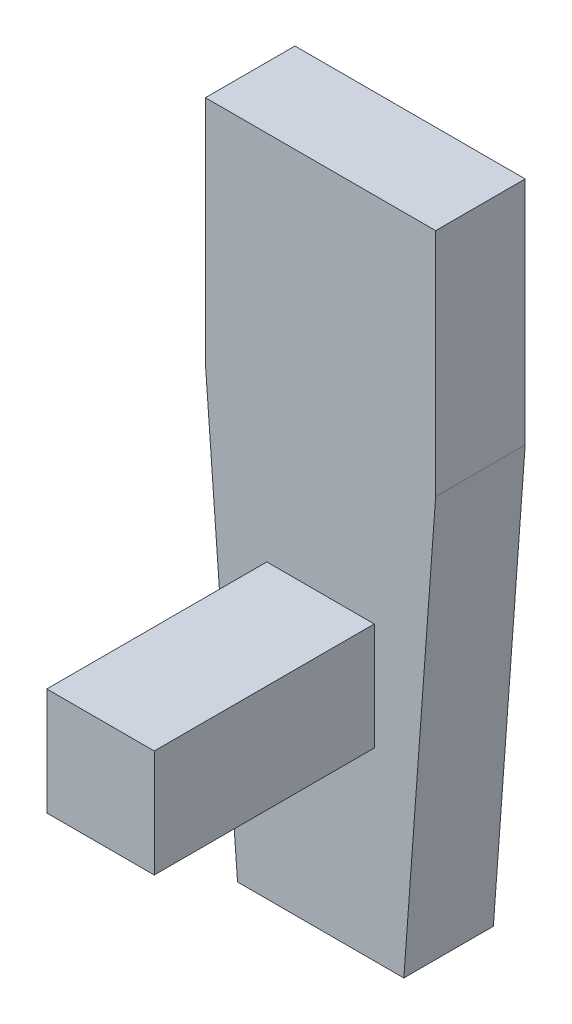
ISO-10303-21;
HEADER;
FILE_DESCRIPTION(('STEP AP214'),'2;1');
FILE_NAME('part.step','',(''),(''),'','','');
FILE_SCHEMA(('AUTOMOTIVE_DESIGN { 1 0 10303 214 1 1 1 1 }'));
ENDSEC;
DATA;
#1=APPLICATION_CONTEXT('core data for automotive mechanical design processes');
#2=APPLICATION_PROTOCOL_DEFINITION('international standard','automotive_design',2000,#1);
#3=PRODUCT_CONTEXT('',#1,'mechanical');
#4=PRODUCT('Part','Part','',(#3));
#5=PRODUCT_RELATED_PRODUCT_CATEGORY('part','',(#4));
#6=PRODUCT_DEFINITION_FORMATION('','',#4);
#7=PRODUCT_DEFINITION_CONTEXT('part definition',#1,'design');
#8=PRODUCT_DEFINITION('design','',#6,#7);
#9=PRODUCT_DEFINITION_SHAPE('','',#8);
#10=(LENGTH_UNIT() NAMED_UNIT(*) SI_UNIT(.MILLI.,.METRE.));
#11=(NAMED_UNIT(*) PLANE_ANGLE_UNIT() SI_UNIT($,.RADIAN.));
#12=(NAMED_UNIT(*) SI_UNIT($,.STERADIAN.) SOLID_ANGLE_UNIT());
#13=UNCERTAINTY_MEASURE_WITH_UNIT(LENGTH_MEASURE(1.E-05),#10,'distance_accuracy_value','');
#14=(GEOMETRIC_REPRESENTATION_CONTEXT(3) GLOBAL_UNCERTAINTY_ASSIGNED_CONTEXT((#13)) GLOBAL_UNIT_ASSIGNED_CONTEXT((#10,
#11,#12)) REPRESENTATION_CONTEXT('',''));
#15=CARTESIAN_POINT('',(0.,0.,0.));
#16=DIRECTION('',(0.,0.,1.));
#17=DIRECTION('',(1.,0.,0.));
#18=AXIS2_PLACEMENT_3D('',#15,#16,#17);
#19=CARTESIAN_POINT('',(35.7099981617146,-2.62608818731381,35.));
#20=DIRECTION('',(0.997306904187828,-0.0733412493709412,0.));
#21=DIRECTION('',(0.0733412493709412,0.997306904187828,0.));
#22=AXIS2_PLACEMENT_3D('',#19,#20,#21);
#23=PLANE('',#22);
#24=DIRECTION('',(-0.0733412493709412,-0.997306904187828,0.));
#25=VECTOR('',#24,1.);
#26=CARTESIAN_POINT('',(35.7099981617146,-2.62608818731381,0.));
#27=LINE('',#26,#25);
#28=CARTESIAN_POINT('',(45.,123.700952225916,0.));
#29=VERTEX_POINT('',#28);
#30=CARTESIAN_POINT('',(32.5551050720874,-45.5268662248671,0.));
#31=VERTEX_POINT('',#30);
#32=EDGE_CURVE('E265',#29,#31,#27,.T.);
#33=ORIENTED_EDGE('',*,*,#32,.F.);
#34=DIRECTION('',(0.,0.,-1.));
#35=VECTOR('',#34,1.);
#36=CARTESIAN_POINT('',(45.,123.700952225916,35.));
#37=LINE('',#36,#35);
#38=CARTESIAN_POINT('',(45.,123.700952225916,35.));
#39=VERTEX_POINT('',#38);
#40=EDGE_CURVE('E11',#39,#29,#37,.T.);
#41=ORIENTED_EDGE('',*,*,#40,.F.);
#42=DIRECTION('',(-0.0733412493709412,-0.997306904187828,0.));
#43=VECTOR('',#42,1.);
#44=CARTESIAN_POINT('',(35.7099981617146,-2.62608818731381,35.));
#45=LINE('',#44,#43);
#46=CARTESIAN_POINT('',(32.5551050720874,-45.5268662248671,35.));
#47=VERTEX_POINT('',#46);
#48=EDGE_CURVE('E266',#39,#47,#45,.T.);
#49=ORIENTED_EDGE('',*,*,#48,.T.);
#50=DIRECTION('',(0.,0.,-1.));
#51=VECTOR('',#50,1.);
#52=CARTESIAN_POINT('',(32.5551050720874,-45.5268662248671,35.));
#53=LINE('',#52,#51);
#54=EDGE_CURVE('E283',#47,#31,#53,.T.);
#55=ORIENTED_EDGE('',*,*,#54,.T.);
#56=EDGE_LOOP('',(#33,#41,#49,#55));
#57=FACE_BOUND('',#56,.T.);
#58=ADVANCED_FACE('F41',(#57),#23,.T.);
#59=CARTESIAN_POINT('',(45.,0.,35.));
#60=DIRECTION('',(-1.,0.,0.));
#61=DIRECTION('',(0.,0.,1.));
#62=AXIS2_PLACEMENT_3D('',#59,#60,#61);
#63=PLANE('',#62);
#64=DIRECTION('',(0.,1.,0.));
#65=VECTOR('',#64,1.);
#66=CARTESIAN_POINT('',(45.,0.,0.));
#67=LINE('',#66,#65);
#68=CARTESIAN_POINT('',(45.,213.700952225916,0.));
#69=VERTEX_POINT('',#68);
#70=EDGE_CURVE('E286',#29,#69,#67,.T.);
#71=ORIENTED_EDGE('',*,*,#70,.T.);
#72=DIRECTION('',(0.,0.,-1.));
#73=VECTOR('',#72,1.);
#74=CARTESIAN_POINT('',(45.,213.700952225916,35.));
#75=LINE('',#74,#73);
#76=CARTESIAN_POINT('',(45.,213.700952225916,35.));
#77=VERTEX_POINT('',#76);
#78=EDGE_CURVE('E48',#77,#69,#75,.T.);
#79=ORIENTED_EDGE('',*,*,#78,.F.);
#80=DIRECTION('',(0.,1.,0.));
#81=VECTOR('',#80,1.);
#82=CARTESIAN_POINT('',(45.,0.,35.));
#83=LINE('',#82,#81);
#84=EDGE_CURVE('E269',#39,#77,#83,.T.);
#85=ORIENTED_EDGE('',*,*,#84,.F.);
#86=ORIENTED_EDGE('',*,*,#40,.T.);
#87=EDGE_LOOP('',(#71,#79,#85,#86));
#88=FACE_BOUND('',#87,.T.);
#89=ADVANCED_FACE('F314',(#88),#63,.F.);
#90=CARTESIAN_POINT('',(0.,213.700952225916,35.));
#91=DIRECTION('',(0.,1.,0.));
#92=DIRECTION('',(0.,0.,1.));
#93=AXIS2_PLACEMENT_3D('',#90,#91,#92);
#94=PLANE('',#93);
#95=DIRECTION('',(1.,0.,0.));
#96=VECTOR('',#95,1.);
#97=CARTESIAN_POINT('',(0.,213.700952225916,0.));
#98=LINE('',#97,#96);
#99=CARTESIAN_POINT('',(-45.,213.700952225916,0.));
#100=VERTEX_POINT('',#99);
#101=EDGE_CURVE('E289',#100,#69,#98,.T.);
#102=ORIENTED_EDGE('',*,*,#101,.F.);
#103=DIRECTION('',(0.,0.,-1.));
#104=VECTOR('',#103,1.);
#105=CARTESIAN_POINT('',(-45.,213.700952225916,35.));
#106=LINE('',#105,#104);
#107=CARTESIAN_POINT('',(-45.,213.700952225916,35.));
#108=VERTEX_POINT('',#107);
#109=EDGE_CURVE('E305',#108,#100,#106,.T.);
#110=ORIENTED_EDGE('',*,*,#109,.F.);
#111=DIRECTION('',(1.,0.,0.));
#112=VECTOR('',#111,1.);
#113=CARTESIAN_POINT('',(0.,213.700952225916,35.));
#114=LINE('',#113,#112);
#115=EDGE_CURVE('E272',#108,#77,#114,.T.);
#116=ORIENTED_EDGE('',*,*,#115,.T.);
#117=ORIENTED_EDGE('',*,*,#78,.T.);
#118=EDGE_LOOP('',(#102,#110,#116,#117));
#119=FACE_BOUND('',#118,.T.);
#120=ADVANCED_FACE('F309',(#119),#94,.T.);
#121=CARTESIAN_POINT('',(-45.,0.,35.));
#122=DIRECTION('',(-1.,0.,0.));
#123=DIRECTION('',(0.,0.,1.));
#124=AXIS2_PLACEMENT_3D('',#121,#122,#123);
#125=PLANE('',#124);
#126=DIRECTION('',(0.,1.,0.));
#127=VECTOR('',#126,1.);
#128=CARTESIAN_POINT('',(-45.,0.,0.));
#129=LINE('',#128,#127);
#130=CARTESIAN_POINT('',(-45.,123.700952225917,0.));
#131=VERTEX_POINT('',#130);
#132=EDGE_CURVE('E292',#131,#100,#129,.T.);
#133=ORIENTED_EDGE('',*,*,#132,.F.);
#134=DIRECTION('',(0.,0.,-1.));
#135=VECTOR('',#134,1.);
#136=CARTESIAN_POINT('',(-45.,123.700952225917,35.));
#137=LINE('',#136,#135);
#138=CARTESIAN_POINT('',(-45.,123.700952225917,35.));
#139=VERTEX_POINT('',#138);
#140=EDGE_CURVE('E303',#139,#131,#137,.T.);
#141=ORIENTED_EDGE('',*,*,#140,.F.);
#142=DIRECTION('',(0.,1.,0.));
#143=VECTOR('',#142,1.);
#144=CARTESIAN_POINT('',(-45.,0.,35.));
#145=LINE('',#144,#143);
#146=EDGE_CURVE('E275',#139,#108,#145,.T.);
#147=ORIENTED_EDGE('',*,*,#146,.T.);
#148=ORIENTED_EDGE('',*,*,#109,.T.);
#149=EDGE_LOOP('',(#133,#141,#147,#148));
#150=FACE_BOUND('',#149,.T.);
#151=ADVANCED_FACE('F322',(#150),#125,.T.);
#152=CARTESIAN_POINT('',(-35.6264616937075,-2.64314681833047,35.));
#153=DIRECTION('',(-0.997259190456473,-0.0739872086924482,0.));
#154=DIRECTION('',(0.0739872086924482,-0.997259190456473,0.));
#155=AXIS2_PLACEMENT_3D('',#152,#153,#154);
#156=PLANE('',#155);
#157=DIRECTION('',(-0.0739872086924482,0.997259190456473,0.));
#158=VECTOR('',#157,1.);
#159=CARTESIAN_POINT('',(-35.6264616937075,-2.64314681833047,0.));
#160=LINE('',#159,#158);
#161=CARTESIAN_POINT('',(-32.4448949279126,-45.5268662248671,0.));
#162=VERTEX_POINT('',#161);
#163=EDGE_CURVE('E295',#162,#131,#160,.T.);
#164=ORIENTED_EDGE('',*,*,#163,.F.);
#165=DIRECTION('',(0.,0.,-1.));
#166=VECTOR('',#165,1.);
#167=CARTESIAN_POINT('',(-32.4448949279126,-45.5268662248671,35.));
#168=LINE('',#167,#166);
#169=CARTESIAN_POINT('',(-32.4448949279126,-45.5268662248671,35.));
#170=VERTEX_POINT('',#169);
#171=EDGE_CURVE('E301',#170,#162,#168,.T.);
#172=ORIENTED_EDGE('',*,*,#171,.F.);
#173=DIRECTION('',(-0.0739872086924482,0.997259190456473,0.));
#174=VECTOR('',#173,1.);
#175=CARTESIAN_POINT('',(-35.6264616937075,-2.64314681833047,35.));
#176=LINE('',#175,#174);
#177=EDGE_CURVE('E278',#170,#139,#176,.T.);
#178=ORIENTED_EDGE('',*,*,#177,.T.);
#179=ORIENTED_EDGE('',*,*,#140,.T.);
#180=EDGE_LOOP('',(#164,#172,#178,#179));
#181=FACE_BOUND('',#180,.T.);
#182=ADVANCED_FACE('F333',(#181),#156,.T.);
#183=CARTESIAN_POINT('',(0.,-45.5268662248671,35.));
#184=DIRECTION('',(0.,1.,0.));
#185=DIRECTION('',(0.,0.,1.));
#186=AXIS2_PLACEMENT_3D('',#183,#184,#185);
#187=PLANE('',#186);
#188=DIRECTION('',(1.,0.,0.));
#189=VECTOR('',#188,1.);
#190=CARTESIAN_POINT('',(0.,-45.5268662248671,0.));
#191=LINE('',#190,#189);
#192=EDGE_CURVE('E270',#162,#31,#191,.T.);
#193=ORIENTED_EDGE('',*,*,#192,.T.);
#194=ORIENTED_EDGE('',*,*,#54,.F.);
#195=DIRECTION('',(1.,0.,0.));
#196=VECTOR('',#195,1.);
#197=CARTESIAN_POINT('',(0.,-45.5268662248671,35.));
#198=LINE('',#197,#196);
#199=EDGE_CURVE('E281',#170,#47,#198,.T.);
#200=ORIENTED_EDGE('',*,*,#199,.F.);
#201=ORIENTED_EDGE('',*,*,#171,.T.);
#202=EDGE_LOOP('',(#193,#194,#200,#201));
#203=FACE_BOUND('',#202,.T.);
#204=ADVANCED_FACE('F334',(#203),#187,.F.);
#205=CARTESIAN_POINT('',(0.,0.,35.));
#206=DIRECTION('',(0.,0.,1.));
#207=DIRECTION('',(1.,0.,0.));
#208=AXIS2_PLACEMENT_3D('',#205,#206,#207);
#209=PLANE('',#208);
#210=DIRECTION('',(0.,1.,0.));
#211=VECTOR('',#210,1.);
#212=CARTESIAN_POINT('',(21.,26.5490732587276,35.));
#213=LINE('',#212,#211);
#214=CARTESIAN_POINT('',(21.,26.5490732587276,35.));
#215=VERTEX_POINT('',#214);
#216=CARTESIAN_POINT('',(21.,68.5490732587276,35.));
#217=VERTEX_POINT('',#216);
#218=EDGE_CURVE('E171',#215,#217,#213,.T.);
#219=ORIENTED_EDGE('',*,*,#218,.F.);
#220=DIRECTION('',(1.,0.,0.));
#221=VECTOR('',#220,1.);
#222=CARTESIAN_POINT('',(-21.,26.5490732587276,35.));
#223=LINE('',#222,#221);
#224=CARTESIAN_POINT('',(-21.,26.5490732587276,35.));
#225=VERTEX_POINT('',#224);
#226=EDGE_CURVE('E237',#225,#215,#223,.T.);
#227=ORIENTED_EDGE('',*,*,#226,.F.);
#228=DIRECTION('',(0.,-1.,0.));
#229=VECTOR('',#228,1.);
#230=CARTESIAN_POINT('',(-21.,26.5490732587276,35.));
#231=LINE('',#230,#229);
#232=CARTESIAN_POINT('',(-21.,68.5490732587276,35.));
#233=VERTEX_POINT('',#232);
#234=EDGE_CURVE('E249',#233,#225,#231,.T.);
#235=ORIENTED_EDGE('',*,*,#234,.F.);
#236=DIRECTION('',(-1.,0.,0.));
#237=VECTOR('',#236,1.);
#238=CARTESIAN_POINT('',(-21.,68.5490732587276,35.));
#239=LINE('',#238,#237);
#240=EDGE_CURVE('E246',#217,#233,#239,.T.);
#241=ORIENTED_EDGE('',*,*,#240,.F.);
#242=EDGE_LOOP('',(#219,#227,#235,#241));
#243=FACE_BOUND('',#242,.T.);
#244=ORIENTED_EDGE('',*,*,#48,.F.);
#245=ORIENTED_EDGE('',*,*,#84,.T.);
#246=ORIENTED_EDGE('',*,*,#115,.F.);
#247=ORIENTED_EDGE('',*,*,#146,.F.);
#248=ORIENTED_EDGE('',*,*,#177,.F.);
#249=ORIENTED_EDGE('',*,*,#199,.T.);
#250=EDGE_LOOP('',(#244,#245,#246,#247,#248,#249));
#251=FACE_BOUND('',#250,.T.);
#252=ADVANCED_FACE('F326',(#243,#251),#209,.T.);
#253=CARTESIAN_POINT('',(0.,0.,0.));
#254=DIRECTION('',(0.,0.,1.));
#255=DIRECTION('',(1.,0.,0.));
#256=AXIS2_PLACEMENT_3D('',#253,#254,#255);
#257=PLANE('',#256);
#258=DIRECTION('',(-0.00555950071674918,-0.999984545856475,0.));
#259=VECTOR('',#258,1.);
#260=CARTESIAN_POINT('',(21.6740739200049,-0.120498891700309,0.));
#261=LINE('',#260,#259);
#262=CARTESIAN_POINT('',(22.4875605860502,146.200930990465,0.));
#263=VERTEX_POINT('',#262);
#264=CARTESIAN_POINT('',(22.0497692514754,67.4556279157162,0.));
#265=VERTEX_POINT('',#264);
#266=EDGE_CURVE('E202',#263,#265,#261,.T.);
#267=ORIENTED_EDGE('',*,*,#266,.F.);
#268=DIRECTION('',(0.,1.,0.));
#269=VECTOR('',#268,1.);
#270=CARTESIAN_POINT('',(22.4875605860503,0.,0.));
#271=LINE('',#270,#269);
#272=CARTESIAN_POINT('',(22.4875605860502,191.200930990465,0.));
#273=VERTEX_POINT('',#272);
#274=EDGE_CURVE('E55',#263,#273,#271,.T.);
#275=ORIENTED_EDGE('',*,*,#274,.T.);
#276=DIRECTION('',(-1.,0.,0.));
#277=VECTOR('',#276,1.);
#278=CARTESIAN_POINT('',(0.,191.200930990465,0.));
#279=LINE('',#278,#277);
#280=CARTESIAN_POINT('',(-22.5124394139497,191.200930990465,0.));
#281=VERTEX_POINT('',#280);
#282=EDGE_CURVE('E60',#273,#281,#279,.T.);
#283=ORIENTED_EDGE('',*,*,#282,.T.);
#284=DIRECTION('',(0.,1.,0.));
#285=VECTOR('',#284,1.);
#286=CARTESIAN_POINT('',(-22.5124394139498,0.,0.));
#287=LINE('',#286,#285);
#288=CARTESIAN_POINT('',(-22.5124394139498,146.200930990465,0.));
#289=VERTEX_POINT('',#288);
#290=EDGE_CURVE('E187',#289,#281,#287,.T.);
#291=ORIENTED_EDGE('',*,*,#290,.F.);
#292=DIRECTION('',(0.00555950071674936,0.999984545856475,0.));
#293=VECTOR('',#292,1.);
#294=CARTESIAN_POINT('',(-23.3245352178253,0.129674774273918,0.));
#295=LINE('',#294,#293);
#296=CARTESIAN_POINT('',(-22.9502307485246,67.4556279157162,0.));
#297=VERTEX_POINT('',#296);
#298=EDGE_CURVE('E212',#297,#289,#295,.T.);
#299=ORIENTED_EDGE('',*,*,#298,.F.);
#300=DIRECTION('',(0.,1.,0.));
#301=VECTOR('',#300,1.);
#302=CARTESIAN_POINT('',(-22.9502307485246,0.,0.));
#303=LINE('',#302,#301);
#304=CARTESIAN_POINT('',(-22.9502307485246,22.4556279157162,0.));
#305=VERTEX_POINT('',#304);
#306=EDGE_CURVE('E209',#305,#297,#303,.T.);
#307=ORIENTED_EDGE('',*,*,#306,.F.);
#308=DIRECTION('',(-1.,0.,0.));
#309=VECTOR('',#308,1.);
#310=CARTESIAN_POINT('',(0.,22.4556279157162,0.));
#311=LINE('',#310,#309);
#312=CARTESIAN_POINT('',(22.0497692514754,22.4556279157162,0.));
#313=VERTEX_POINT('',#312);
#314=EDGE_CURVE('E206',#313,#305,#311,.T.);
#315=ORIENTED_EDGE('',*,*,#314,.F.);
#316=DIRECTION('',(0.,1.,0.));
#317=VECTOR('',#316,1.);
#318=CARTESIAN_POINT('',(22.0497692514754,0.,0.));
#319=LINE('',#318,#317);
#320=EDGE_CURVE('E204',#313,#265,#319,.T.);
#321=ORIENTED_EDGE('',*,*,#320,.T.);
#322=EDGE_LOOP('',(#267,#275,#283,#291,#299,#307,#315,#321));
#323=FACE_BOUND('',#322,.T.);
#324=ORIENTED_EDGE('',*,*,#32,.T.);
#325=ORIENTED_EDGE('',*,*,#192,.F.);
#326=ORIENTED_EDGE('',*,*,#163,.T.);
#327=ORIENTED_EDGE('',*,*,#132,.T.);
#328=ORIENTED_EDGE('',*,*,#101,.T.);
#329=ORIENTED_EDGE('',*,*,#70,.F.);
#330=EDGE_LOOP('',(#324,#325,#326,#327,#328,#329));
#331=FACE_BOUND('',#330,.T.);
#332=ADVANCED_FACE('F317',(#323,#331),#257,.F.);
#333=CARTESIAN_POINT('',(21.,26.5490732587276,121.));
#334=DIRECTION('',(-1.,0.,0.));
#335=DIRECTION('',(0.,0.,1.));
#336=AXIS2_PLACEMENT_3D('',#333,#334,#335);
#337=PLANE('',#336);
#338=ORIENTED_EDGE('',*,*,#218,.T.);
#339=DIRECTION('',(0.,0.,-1.));
#340=VECTOR('',#339,1.);
#341=CARTESIAN_POINT('',(21.,68.5490732587276,121.));
#342=LINE('',#341,#340);
#343=CARTESIAN_POINT('',(21.,68.5490732587276,121.));
#344=VERTEX_POINT('',#343);
#345=EDGE_CURVE('E262',#344,#217,#342,.T.);
#346=ORIENTED_EDGE('',*,*,#345,.F.);
#347=DIRECTION('',(0.,1.,0.));
#348=VECTOR('',#347,1.);
#349=CARTESIAN_POINT('',(21.,26.5490732587276,121.));
#350=LINE('',#349,#348);
#351=CARTESIAN_POINT('',(21.,26.5490732587276,121.));
#352=VERTEX_POINT('',#351);
#353=EDGE_CURVE('E233',#352,#344,#350,.T.);
#354=ORIENTED_EDGE('',*,*,#353,.F.);
#355=DIRECTION('',(0.,0.,-1.));
#356=VECTOR('',#355,1.);
#357=CARTESIAN_POINT('',(21.,26.5490732587276,121.));
#358=LINE('',#357,#356);
#359=EDGE_CURVE('E243',#352,#215,#358,.T.);
#360=ORIENTED_EDGE('',*,*,#359,.T.);
#361=EDGE_LOOP('',(#338,#346,#354,#360));
#362=FACE_BOUND('',#361,.T.);
#363=ADVANCED_FACE('F400',(#362),#337,.F.);
#364=CARTESIAN_POINT('',(-21.,68.5490732587276,121.));
#365=DIRECTION('',(0.,-1.,0.));
#366=DIRECTION('',(0.,0.,-1.));
#367=AXIS2_PLACEMENT_3D('',#364,#365,#366);
#368=PLANE('',#367);
#369=ORIENTED_EDGE('',*,*,#240,.T.);
#370=DIRECTION('',(0.,0.,-1.));
#371=VECTOR('',#370,1.);
#372=CARTESIAN_POINT('',(-21.,68.5490732587276,121.));
#373=LINE('',#372,#371);
#374=CARTESIAN_POINT('',(-21.,68.5490732587276,121.));
#375=VERTEX_POINT('',#374);
#376=EDGE_CURVE('E259',#375,#233,#373,.T.);
#377=ORIENTED_EDGE('',*,*,#376,.F.);
#378=DIRECTION('',(-1.,0.,0.));
#379=VECTOR('',#378,1.);
#380=CARTESIAN_POINT('',(-21.,68.5490732587276,121.));
#381=LINE('',#380,#379);
#382=EDGE_CURVE('E236',#344,#375,#381,.T.);
#383=ORIENTED_EDGE('',*,*,#382,.F.);
#384=ORIENTED_EDGE('',*,*,#345,.T.);
#385=EDGE_LOOP('',(#369,#377,#383,#384));
#386=FACE_BOUND('',#385,.T.);
#387=ADVANCED_FACE('F424',(#386),#368,.F.);
#388=CARTESIAN_POINT('',(-21.,26.5490732587276,121.));
#389=DIRECTION('',(1.,0.,0.));
#390=DIRECTION('',(0.,0.,-1.));
#391=AXIS2_PLACEMENT_3D('',#388,#389,#390);
#392=PLANE('',#391);
#393=ORIENTED_EDGE('',*,*,#234,.T.);
#394=DIRECTION('',(0.,0.,-1.));
#395=VECTOR('',#394,1.);
#396=CARTESIAN_POINT('',(-21.,26.5490732587276,121.));
#397=LINE('',#396,#395);
#398=CARTESIAN_POINT('',(-21.,26.5490732587276,121.));
#399=VERTEX_POINT('',#398);
#400=EDGE_CURVE('E256',#399,#225,#397,.T.);
#401=ORIENTED_EDGE('',*,*,#400,.F.);
#402=DIRECTION('',(0.,-1.,0.));
#403=VECTOR('',#402,1.);
#404=CARTESIAN_POINT('',(-21.,26.5490732587276,121.));
#405=LINE('',#404,#403);
#406=EDGE_CURVE('E239',#375,#399,#405,.T.);
#407=ORIENTED_EDGE('',*,*,#406,.F.);
#408=ORIENTED_EDGE('',*,*,#376,.T.);
#409=EDGE_LOOP('',(#393,#401,#407,#408));
#410=FACE_BOUND('',#409,.T.);
#411=ADVANCED_FACE('F434',(#410),#392,.F.);
#412=CARTESIAN_POINT('',(-21.,26.5490732587276,121.));
#413=DIRECTION('',(0.,1.,0.));
#414=DIRECTION('',(0.,0.,1.));
#415=AXIS2_PLACEMENT_3D('',#412,#413,#414);
#416=PLANE('',#415);
#417=ORIENTED_EDGE('',*,*,#226,.T.);
#418=ORIENTED_EDGE('',*,*,#359,.F.);
#419=DIRECTION('',(1.,0.,0.));
#420=VECTOR('',#419,1.);
#421=CARTESIAN_POINT('',(-21.,26.5490732587276,121.));
#422=LINE('',#421,#420);
#423=EDGE_CURVE('E241',#399,#352,#422,.T.);
#424=ORIENTED_EDGE('',*,*,#423,.F.);
#425=ORIENTED_EDGE('',*,*,#400,.T.);
#426=EDGE_LOOP('',(#417,#418,#424,#425));
#427=FACE_BOUND('',#426,.T.);
#428=ADVANCED_FACE('F444',(#427),#416,.F.);
#429=CARTESIAN_POINT('',(0.,0.,121.));
#430=DIRECTION('',(0.,0.,-1.));
#431=DIRECTION('',(-1.,0.,0.));
#432=AXIS2_PLACEMENT_3D('',#429,#430,#431);
#433=PLANE('',#432);
#434=ORIENTED_EDGE('',*,*,#353,.T.);
#435=ORIENTED_EDGE('',*,*,#382,.T.);
#436=ORIENTED_EDGE('',*,*,#406,.T.);
#437=ORIENTED_EDGE('',*,*,#423,.T.);
#438=EDGE_LOOP('',(#434,#435,#436,#437));
#439=FACE_BOUND('',#438,.T.);
#440=ADVANCED_FACE('F454',(#439),#433,.F.);
#441=CARTESIAN_POINT('',(22.4875605860503,0.,-14.9999999999999));
#442=DIRECTION('',(1.,0.,0.));
#443=DIRECTION('',(0.,1.,0.));
#444=AXIS2_PLACEMENT_3D('',#441,#442,#443);
#445=PLANE('',#444);
#446=ORIENTED_EDGE('',*,*,#274,.F.);
#447=DIRECTION('',(0.,0.,1.));
#448=VECTOR('',#447,1.);
#449=CARTESIAN_POINT('',(22.4875605860502,146.200930990465,-14.9999999999999));
#450=LINE('',#449,#448);
#451=CARTESIAN_POINT('',(22.4875605860502,146.200930990465,-14.9999999999999));
#452=VERTEX_POINT('',#451);
#453=EDGE_CURVE('E163',#452,#263,#450,.T.);
#454=ORIENTED_EDGE('',*,*,#453,.F.);
#455=DIRECTION('',(0.,1.,0.));
#456=VECTOR('',#455,1.);
#457=CARTESIAN_POINT('',(22.4875605860503,0.,-14.9999999999999));
#458=LINE('',#457,#456);
#459=CARTESIAN_POINT('',(22.4875605860502,191.200930990465,-14.9999999999999));
#460=VERTEX_POINT('',#459);
#461=EDGE_CURVE('E167',#452,#460,#458,.T.);
#462=ORIENTED_EDGE('',*,*,#461,.T.);
#463=DIRECTION('',(0.,0.,1.));
#464=VECTOR('',#463,1.);
#465=CARTESIAN_POINT('',(22.4875605860502,191.200930990465,-14.9999999999999));
#466=LINE('',#465,#464);
#467=EDGE_CURVE('E200',#460,#273,#466,.T.);
#468=ORIENTED_EDGE('',*,*,#467,.T.);
#469=EDGE_LOOP('',(#446,#454,#462,#468));
#470=FACE_BOUND('',#469,.T.);
#471=ADVANCED_FACE('F165',(#470),#445,.T.);
#472=CARTESIAN_POINT('',(21.6740739200049,-0.120498891700309,-14.9999999999999));
#473=DIRECTION('',(-0.999984545856475,0.00555950071674918,0.));
#474=DIRECTION('',(-0.00555950071674918,-0.999984545856475,0.));
#475=AXIS2_PLACEMENT_3D('',#472,#473,#474);
#476=PLANE('',#475);
#477=ORIENTED_EDGE('',*,*,#266,.T.);
#478=DIRECTION('',(0.,0.,1.));
#479=VECTOR('',#478,1.);
#480=CARTESIAN_POINT('',(22.0497692514754,67.4556279157162,-14.9999999999999));
#481=LINE('',#480,#479);
#482=CARTESIAN_POINT('',(22.0497692514754,67.4556279157162,-14.9999999999999));
#483=VERTEX_POINT('',#482);
#484=EDGE_CURVE('E172',#483,#265,#481,.T.);
#485=ORIENTED_EDGE('',*,*,#484,.F.);
#486=DIRECTION('',(-0.00555950071674918,-0.999984545856475,0.));
#487=VECTOR('',#486,1.);
#488=CARTESIAN_POINT('',(21.6740739200049,-0.120498891700309,-14.9999999999999));
#489=LINE('',#488,#487);
#490=EDGE_CURVE('E175',#452,#483,#489,.T.);
#491=ORIENTED_EDGE('',*,*,#490,.F.);
#492=ORIENTED_EDGE('',*,*,#453,.T.);
#493=EDGE_LOOP('',(#477,#485,#491,#492));
#494=FACE_BOUND('',#493,.T.);
#495=ADVANCED_FACE('F176',(#494),#476,.F.);
#496=CARTESIAN_POINT('',(22.0497692514754,0.,-14.9999999999999));
#497=DIRECTION('',(1.,0.,0.));
#498=DIRECTION('',(0.,0.,-1.));
#499=AXIS2_PLACEMENT_3D('',#496,#497,#498);
#500=PLANE('',#499);
#501=ORIENTED_EDGE('',*,*,#320,.F.);
#502=DIRECTION('',(0.,0.,1.));
#503=VECTOR('',#502,1.);
#504=CARTESIAN_POINT('',(22.0497692514754,22.4556279157162,-14.9999999999999));
#505=LINE('',#504,#503);
#506=CARTESIAN_POINT('',(22.0497692514754,22.4556279157162,-14.9999999999999));
#507=VERTEX_POINT('',#506);
#508=EDGE_CURVE('E229',#507,#313,#505,.T.);
#509=ORIENTED_EDGE('',*,*,#508,.F.);
#510=DIRECTION('',(0.,1.,0.));
#511=VECTOR('',#510,1.);
#512=CARTESIAN_POINT('',(22.0497692514754,0.,-14.9999999999999));
#513=LINE('',#512,#511);
#514=EDGE_CURVE('E181',#507,#483,#513,.T.);
#515=ORIENTED_EDGE('',*,*,#514,.T.);
#516=ORIENTED_EDGE('',*,*,#484,.T.);
#517=EDGE_LOOP('',(#501,#509,#515,#516));
#518=FACE_BOUND('',#517,.T.);
#519=ADVANCED_FACE('F479',(#518),#500,.T.);
#520=CARTESIAN_POINT('',(0.,22.4556279157162,-14.9999999999999));
#521=DIRECTION('',(0.,1.,0.));
#522=DIRECTION('',(0.,0.,1.));
#523=AXIS2_PLACEMENT_3D('',#520,#521,#522);
#524=PLANE('',#523);
#525=ORIENTED_EDGE('',*,*,#314,.T.);
#526=DIRECTION('',(0.,0.,1.));
#527=VECTOR('',#526,1.);
#528=CARTESIAN_POINT('',(-22.9502307485246,22.4556279157162,-14.9999999999999));
#529=LINE('',#528,#527);
#530=CARTESIAN_POINT('',(-22.9502307485246,22.4556279157162,-14.9999999999999));
#531=VERTEX_POINT('',#530);
#532=EDGE_CURVE('E226',#531,#305,#529,.T.);
#533=ORIENTED_EDGE('',*,*,#532,.F.);
#534=DIRECTION('',(-1.,0.,0.));
#535=VECTOR('',#534,1.);
#536=CARTESIAN_POINT('',(0.,22.4556279157162,-14.9999999999999));
#537=LINE('',#536,#535);
#538=EDGE_CURVE('E191',#507,#531,#537,.T.);
#539=ORIENTED_EDGE('',*,*,#538,.F.);
#540=ORIENTED_EDGE('',*,*,#508,.T.);
#541=EDGE_LOOP('',(#525,#533,#539,#540));
#542=FACE_BOUND('',#541,.T.);
#543=ADVANCED_FACE('F488',(#542),#524,.F.);
#544=CARTESIAN_POINT('',(-22.9502307485246,0.,-14.9999999999999));
#545=DIRECTION('',(1.,0.,0.));
#546=DIRECTION('',(0.,0.,-1.));
#547=AXIS2_PLACEMENT_3D('',#544,#545,#546);
#548=PLANE('',#547);
#549=ORIENTED_EDGE('',*,*,#306,.T.);
#550=DIRECTION('',(0.,0.,1.));
#551=VECTOR('',#550,1.);
#552=CARTESIAN_POINT('',(-22.9502307485246,67.4556279157162,-14.9999999999999));
#553=LINE('',#552,#551);
#554=CARTESIAN_POINT('',(-22.9502307485246,67.4556279157162,-14.9999999999999));
#555=VERTEX_POINT('',#554);
#556=EDGE_CURVE('E223',#555,#297,#553,.T.);
#557=ORIENTED_EDGE('',*,*,#556,.F.);
#558=DIRECTION('',(0.,1.,0.));
#559=VECTOR('',#558,1.);
#560=CARTESIAN_POINT('',(-22.9502307485246,0.,-14.9999999999999));
#561=LINE('',#560,#559);
#562=EDGE_CURVE('E193',#531,#555,#561,.T.);
#563=ORIENTED_EDGE('',*,*,#562,.F.);
#564=ORIENTED_EDGE('',*,*,#532,.T.);
#565=EDGE_LOOP('',(#549,#557,#563,#564));
#566=FACE_BOUND('',#565,.T.);
#567=ADVANCED_FACE('F498',(#566),#548,.F.);
#568=CARTESIAN_POINT('',(-23.3245352178253,0.129674774273918,-14.9999999999999));
#569=DIRECTION('',(0.999984545856475,-0.00555950071674935,0.));
#570=DIRECTION('',(0.00555950071674936,0.999984545856475,0.));
#571=AXIS2_PLACEMENT_3D('',#568,#569,#570);
#572=PLANE('',#571);
#573=ORIENTED_EDGE('',*,*,#298,.T.);
#574=DIRECTION('',(0.,0.,1.));
#575=VECTOR('',#574,1.);
#576=CARTESIAN_POINT('',(-22.5124394139498,146.200930990465,-14.9999999999999));
#577=LINE('',#576,#575);
#578=CARTESIAN_POINT('',(-22.5124394139498,146.200930990465,-14.9999999999999));
#579=VERTEX_POINT('',#578);
#580=EDGE_CURVE('E220',#579,#289,#577,.T.);
#581=ORIENTED_EDGE('',*,*,#580,.F.);
#582=DIRECTION('',(0.00555950071674936,0.999984545856475,0.));
#583=VECTOR('',#582,1.);
#584=CARTESIAN_POINT('',(-23.3245352178253,0.129674774273918,-14.9999999999999));
#585=LINE('',#584,#583);
#586=EDGE_CURVE('E195',#555,#579,#585,.T.);
#587=ORIENTED_EDGE('',*,*,#586,.F.);
#588=ORIENTED_EDGE('',*,*,#556,.T.);
#589=EDGE_LOOP('',(#573,#581,#587,#588));
#590=FACE_BOUND('',#589,.T.);
#591=ADVANCED_FACE('F508',(#590),#572,.F.);
#592=CARTESIAN_POINT('',(-22.5124394139498,0.,-14.9999999999999));
#593=DIRECTION('',(1.,0.,0.));
#594=DIRECTION('',(0.,1.,0.));
#595=AXIS2_PLACEMENT_3D('',#592,#593,#594);
#596=PLANE('',#595);
#597=ORIENTED_EDGE('',*,*,#290,.T.);
#598=DIRECTION('',(0.,0.,1.));
#599=VECTOR('',#598,1.);
#600=CARTESIAN_POINT('',(-22.5124394139497,191.200930990465,-14.9999999999999));
#601=LINE('',#600,#599);
#602=CARTESIAN_POINT('',(-22.5124394139497,191.200930990465,-14.9999999999999));
#603=VERTEX_POINT('',#602);
#604=EDGE_CURVE('E218',#603,#281,#601,.T.);
#605=ORIENTED_EDGE('',*,*,#604,.F.);
#606=DIRECTION('',(0.,1.,0.));
#607=VECTOR('',#606,1.);
#608=CARTESIAN_POINT('',(-22.5124394139498,0.,-14.9999999999999));
#609=LINE('',#608,#607);
#610=EDGE_CURVE('E197',#579,#603,#609,.T.);
#611=ORIENTED_EDGE('',*,*,#610,.F.);
#612=ORIENTED_EDGE('',*,*,#580,.T.);
#613=EDGE_LOOP('',(#597,#605,#611,#612));
#614=FACE_BOUND('',#613,.T.);
#615=ADVANCED_FACE('F518',(#614),#596,.F.);
#616=CARTESIAN_POINT('',(0.,191.200930990465,-14.9999999999999));
#617=DIRECTION('',(0.,1.,0.));
#618=DIRECTION('',(0.,0.,1.));
#619=AXIS2_PLACEMENT_3D('',#616,#617,#618);
#620=PLANE('',#619);
#621=ORIENTED_EDGE('',*,*,#282,.F.);
#622=ORIENTED_EDGE('',*,*,#467,.F.);
#623=DIRECTION('',(-1.,0.,0.));
#624=VECTOR('',#623,1.);
#625=CARTESIAN_POINT('',(0.,191.200930990465,-14.9999999999999));
#626=LINE('',#625,#624);
#627=EDGE_CURVE('E185',#460,#603,#626,.T.);
#628=ORIENTED_EDGE('',*,*,#627,.T.);
#629=ORIENTED_EDGE('',*,*,#604,.T.);
#630=EDGE_LOOP('',(#621,#622,#628,#629));
#631=FACE_BOUND('',#630,.T.);
#632=ADVANCED_FACE('F528',(#631),#620,.T.);
#633=CARTESIAN_POINT('',(0.,0.,-14.9999999999999));
#634=DIRECTION('',(0.,0.,-1.));
#635=DIRECTION('',(-1.,0.,0.));
#636=AXIS2_PLACEMENT_3D('',#633,#634,#635);
#637=PLANE('',#636);
#638=ORIENTED_EDGE('',*,*,#461,.F.);
#639=ORIENTED_EDGE('',*,*,#490,.T.);
#640=ORIENTED_EDGE('',*,*,#514,.F.);
#641=ORIENTED_EDGE('',*,*,#538,.T.);
#642=ORIENTED_EDGE('',*,*,#562,.T.);
#643=ORIENTED_EDGE('',*,*,#586,.T.);
#644=ORIENTED_EDGE('',*,*,#610,.T.);
#645=ORIENTED_EDGE('',*,*,#627,.F.);
#646=EDGE_LOOP('',(#638,#639,#640,#641,#642,#643,#644,#645));
#647=FACE_BOUND('',#646,.T.);
#648=ADVANCED_FACE('F183',(#647),#637,.T.);
#649=CLOSED_SHELL('',(#58,#89,#120,#151,#182,#204,#252,#332,#363,#387,#411,#428,#440,#471,#495,
#519,#543,#567,#591,#615,#632,#648));
#650=MANIFOLD_SOLID_BREP('B2',#649);
#651=ADVANCED_BREP_SHAPE_REPRESENTATION('',(#18,#650),#14);
#652=SHAPE_DEFINITION_REPRESENTATION(#9,#651);
ENDSEC;
END-ISO-10303-21;
